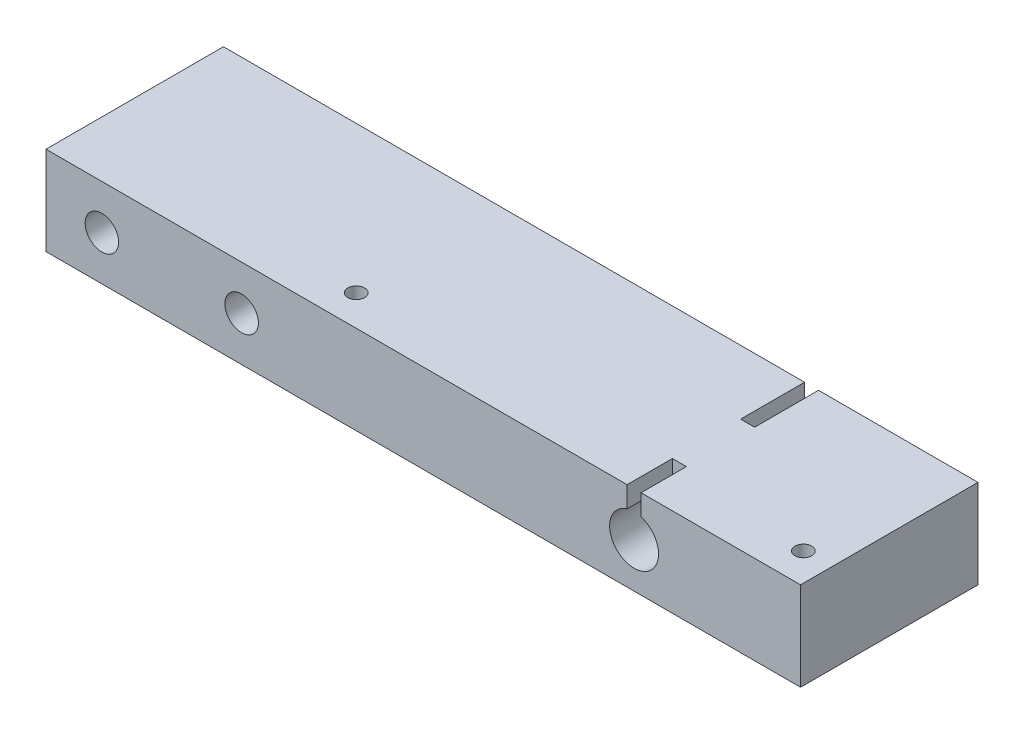
ISO-10303-21;
HEADER;
FILE_DESCRIPTION(('STEP AP214'),'2;1');
FILE_NAME('part.step','',(''),(''),'','','');
FILE_SCHEMA(('AUTOMOTIVE_DESIGN { 1 0 10303 214 1 1 1 1 }'));
ENDSEC;
DATA;
#1=APPLICATION_CONTEXT('core data for automotive mechanical design processes');
#2=APPLICATION_PROTOCOL_DEFINITION('international standard','automotive_design',2000,#1);
#3=PRODUCT_CONTEXT('',#1,'mechanical');
#4=PRODUCT('Part','Part','',(#3));
#5=PRODUCT_RELATED_PRODUCT_CATEGORY('part','',(#4));
#6=PRODUCT_DEFINITION_FORMATION('','',#4);
#7=PRODUCT_DEFINITION_CONTEXT('part definition',#1,'design');
#8=PRODUCT_DEFINITION('design','',#6,#7);
#9=PRODUCT_DEFINITION_SHAPE('','',#8);
#10=(LENGTH_UNIT() NAMED_UNIT(*) SI_UNIT(.MILLI.,.METRE.));
#11=(NAMED_UNIT(*) PLANE_ANGLE_UNIT() SI_UNIT($,.RADIAN.));
#12=(NAMED_UNIT(*) SI_UNIT($,.STERADIAN.) SOLID_ANGLE_UNIT());
#13=UNCERTAINTY_MEASURE_WITH_UNIT(LENGTH_MEASURE(1.E-05),#10,'distance_accuracy_value','');
#14=(GEOMETRIC_REPRESENTATION_CONTEXT(3) GLOBAL_UNCERTAINTY_ASSIGNED_CONTEXT((#13)) GLOBAL_UNIT_ASSIGNED_CONTEXT((#10,
#11,#12)) REPRESENTATION_CONTEXT('',''));
#15=CARTESIAN_POINT('',(0.,0.,0.));
#16=DIRECTION('',(0.,0.,1.));
#17=DIRECTION('',(1.,0.,0.));
#18=AXIS2_PLACEMENT_3D('',#15,#16,#17);
#19=CARTESIAN_POINT('',(42.0877150460028,3.175,0.));
#20=DIRECTION('',(0.,0.,1.));
#21=DIRECTION('',(1.,0.,0.));
#22=AXIS2_PLACEMENT_3D('',#19,#20,#21);
#23=CYLINDRICAL_SURFACE('',#22,1.75);
#24=CARTESIAN_POINT('',(42.0877150460028,3.175,9.45688860373222));
#25=DIRECTION('',(0.,0.,-1.));
#26=DIRECTION('',(-1.,0.,0.));
#27=AXIS2_PLACEMENT_3D('',#24,#25,#26);
#28=CIRCLE('',#27,1.75);
#29=CARTESIAN_POINT('',(41.5877150460028,4.85205098312485,9.45688860373222));
#30=VERTEX_POINT('',#29);
#31=CARTESIAN_POINT('',(42.5877150460028,4.85205098312485,9.45688860373222));
#32=VERTEX_POINT('',#31);
#33=EDGE_CURVE('E322',#30,#32,#28,.T.);
#34=ORIENTED_EDGE('',*,*,#33,.F.);
#35=DIRECTION('',(0.,0.,1.));
#36=VECTOR('',#35,1.);
#37=CARTESIAN_POINT('',(41.5877150460028,4.85205098312485,0.));
#38=LINE('',#37,#36);
#39=CARTESIAN_POINT('',(41.5877150460028,4.85205098312485,12.7));
#40=VERTEX_POINT('',#39);
#41=EDGE_CURVE('E323',#40,#30,#38,.F.);
#42=ORIENTED_EDGE('',*,*,#41,.F.);
#43=CARTESIAN_POINT('',(42.0877150460028,3.175,12.7));
#44=DIRECTION('',(0.,0.,1.));
#45=DIRECTION('',(1.,0.,0.));
#46=AXIS2_PLACEMENT_3D('',#43,#44,#45);
#47=CIRCLE('',#46,1.75);
#48=CARTESIAN_POINT('',(42.5877150460028,4.85205098312485,12.7));
#49=VERTEX_POINT('',#48);
#50=EDGE_CURVE('E318',#40,#49,#47,.T.);
#51=ORIENTED_EDGE('',*,*,#50,.T.);
#52=DIRECTION('',(0.,0.,1.));
#53=VECTOR('',#52,1.);
#54=CARTESIAN_POINT('',(42.5877150460028,4.85205098312485,0.));
#55=LINE('',#54,#53);
#56=EDGE_CURVE('E72',#32,#49,#55,.T.);
#57=ORIENTED_EDGE('',*,*,#56,.F.);
#58=EDGE_LOOP('',(#34,#42,#51,#57));
#59=FACE_BOUND('',#58,.T.);
#60=CARTESIAN_POINT('',(42.0877150460028,3.175,0.));
#61=DIRECTION('',(0.,0.,1.));
#62=DIRECTION('',(1.,0.,0.));
#63=AXIS2_PLACEMENT_3D('',#60,#61,#62);
#64=CIRCLE('',#63,1.75);
#65=CARTESIAN_POINT('',(41.5877150460028,4.85205098312485,0.));
#66=VERTEX_POINT('',#65);
#67=CARTESIAN_POINT('',(42.5877150460028,4.85205098312485,0.));
#68=VERTEX_POINT('',#67);
#69=EDGE_CURVE('E259',#66,#68,#64,.T.);
#70=ORIENTED_EDGE('',*,*,#69,.F.);
#71=DIRECTION('',(0.,0.,1.));
#72=VECTOR('',#71,1.);
#73=CARTESIAN_POINT('',(41.5877150460028,4.85205098312485,0.));
#74=LINE('',#73,#72);
#75=CARTESIAN_POINT('',(41.5877150460028,4.85205098312485,4.57737416325741));
#76=VERTEX_POINT('',#75);
#77=EDGE_CURVE('E146',#76,#66,#74,.F.);
#78=ORIENTED_EDGE('',*,*,#77,.F.);
#79=CARTESIAN_POINT('',(42.0877150460028,3.175,4.57737416325741));
#80=DIRECTION('',(0.,0.,1.));
#81=DIRECTION('',(1.,0.,0.));
#82=AXIS2_PLACEMENT_3D('',#79,#80,#81);
#83=CIRCLE('',#82,1.75);
#84=CARTESIAN_POINT('',(42.5877150460028,4.85205098312485,4.57737416325741));
#85=VERTEX_POINT('',#84);
#86=EDGE_CURVE('E328',#85,#76,#83,.T.);
#87=ORIENTED_EDGE('',*,*,#86,.F.);
#88=DIRECTION('',(0.,0.,1.));
#89=VECTOR('',#88,1.);
#90=CARTESIAN_POINT('',(42.5877150460028,4.85205098312485,0.));
#91=LINE('',#90,#89);
#92=EDGE_CURVE('E310',#68,#85,#91,.T.);
#93=ORIENTED_EDGE('',*,*,#92,.F.);
#94=EDGE_LOOP('',(#70,#78,#87,#93));
#95=FACE_BOUND('',#94,.T.);
#96=CARTESIAN_POINT('',(41.2438838747358,1.64188260253881,7.26658983962968));
#97=CARTESIAN_POINT('',(41.2335650177173,1.64755872849969,7.23395177097413));
#98=CARTESIAN_POINT('',(41.2224999040513,1.65378757728156,7.20166301545152));
#99=CARTESIAN_POINT('',(41.1991993498274,1.66728057297219,7.13774593563371));
#100=CARTESIAN_POINT('',(41.1869644628288,1.67454423097898,7.10611730750206));
#101=CARTESIAN_POINT('',(41.1616156704365,1.69005475189646,7.04340077345724));
#102=CARTESIAN_POINT('',(41.1485003700154,1.69830319211153,7.01231382891692));
#103=CARTESIAN_POINT('',(41.1215830591988,1.71577206412213,6.95071205536086));
#104=CARTESIAN_POINT('',(41.1077809480405,1.72499263876419,6.92019731120298));
#105=CARTESIAN_POINT('',(41.0647349961694,1.75470022167026,6.82776290475933));
#106=CARTESIAN_POINT('',(41.0345988282322,1.77678867093154,6.76676294826807));
#107=CARTESIAN_POINT('',(40.9726773192387,1.82564723348366,6.64758017880724));
#108=CARTESIAN_POINT('',(40.9408935065667,1.85241306073934,6.58939484849348));
#109=CARTESIAN_POINT('',(40.8925257873214,1.89653080040825,6.50551288026816));
#110=CARTESIAN_POINT('',(40.8764555772022,1.91172339009301,6.47837895293198));
#111=CARTESIAN_POINT('',(40.8440026826922,1.94365974413757,6.42521690843567));
#112=CARTESIAN_POINT('',(40.8276199497959,1.96040375086824,6.39918896498796));
#113=CARTESIAN_POINT('',(40.794684922765,1.99553032647495,6.3487218309668));
#114=CARTESIAN_POINT('',(40.7781346954653,2.0139002449356,6.32427256050699));
#115=CARTESIAN_POINT('',(40.7447855811818,2.0526392927315,6.27721073484628));
#116=CARTESIAN_POINT('',(40.7279869017106,2.07300682574612,6.25459673904181));
#117=CARTESIAN_POINT('',(40.696021010136,2.11373524221223,6.21418679800306));
#118=CARTESIAN_POINT('',(40.6808752965179,2.13385542447774,6.19613434835597));
#119=CARTESIAN_POINT('',(40.6504600649125,2.17626096009308,6.16270581242354));
#120=CARTESIAN_POINT('',(40.6351903535373,2.19855077818875,6.147335434865));
#121=CARTESIAN_POINT('',(40.6045005564306,2.24581660613839,6.12022564826844));
#122=CARTESIAN_POINT('',(40.5890817631258,2.27082861455845,6.10854563208531));
#123=CARTESIAN_POINT('',(40.5587793368609,2.3230887774856,6.09091902595638));
#124=CARTESIAN_POINT('',(40.5438934583036,2.35032541619094,6.08494471745577));
#125=CARTESIAN_POINT('',(40.520945469859,2.39519130509058,6.0814766297643));
#126=CARTESIAN_POINT('',(40.5124835177673,2.41243134571713,6.08158630864867));
#127=CARTESIAN_POINT('',(40.4962460897301,2.44692850846639,6.08496539696803));
#128=CARTESIAN_POINT('',(40.4884700662718,2.46418560564098,6.08823226094947));
#129=CARTESIAN_POINT('',(40.4737839570593,2.49819068608464,6.09799086782508));
#130=CARTESIAN_POINT('',(40.4668755389638,2.51493764339317,6.10448870576624));
#131=CARTESIAN_POINT('',(40.4540446169743,2.54736476821522,6.12044692682219));
#132=CARTESIAN_POINT('',(40.4481228589089,2.56304412346849,6.12990953562103));
#133=CARTESIAN_POINT('',(40.4361304413012,2.59608784086249,6.15355404782419));
#134=CARTESIAN_POINT('',(40.4302859036074,2.61312246291518,6.16830847500826));
#135=CARTESIAN_POINT('',(40.4198662857908,2.64484874917086,6.20052628995993));
#136=CARTESIAN_POINT('',(40.4152934050424,2.65953633566681,6.21799429063925));
#137=CARTESIAN_POINT('',(40.4054283293952,2.69247981159572,6.26288611663973));
#138=CARTESIAN_POINT('',(40.4006909692434,2.70950177771244,6.29133142475929));
#139=CARTESIAN_POINT('',(40.3927800045866,2.73919221470893,6.35059284016948));
#140=CARTESIAN_POINT('',(40.389609755295,2.75185132725501,6.38141387235716));
#141=CARTESIAN_POINT('',(40.3830924132969,2.77871036693604,6.4603940847559));
#142=CARTESIAN_POINT('',(40.3804652523578,2.79045724640224,6.50944549924021));
#143=CARTESIAN_POINT('',(40.3769674222684,2.80635378221299,6.60879425987928));
#144=CARTESIAN_POINT('',(40.3760995693341,2.81049125680642,6.65909347339995));
#145=CARTESIAN_POINT('',(40.3757621247964,2.81205918646597,6.77330243236777));
#146=CARTESIAN_POINT('',(40.3767296549285,2.80739472676518,6.83724671538222));
#147=CARTESIAN_POINT('',(40.3810429680997,2.78787523931907,6.96343670421357));
#148=CARTESIAN_POINT('',(40.3843889135712,2.77301951557001,7.02568229371775));
#149=CARTESIAN_POINT('',(40.3941322478079,2.73376656453801,7.14717063378087));
#150=CARTESIAN_POINT('',(40.4005438778755,2.70932490306721,7.20639792755254));
#151=CARTESIAN_POINT('',(40.4174516495669,2.65192176717033,7.31992332178574));
#152=CARTESIAN_POINT('',(40.4279466776359,2.61896261631151,7.37422276111372));
#153=CARTESIAN_POINT('',(40.4544786972412,2.54523792277631,7.47755580460451));
#154=CARTESIAN_POINT('',(40.470628566139,2.50432156621177,7.52645321334753));
#155=CARTESIAN_POINT('',(40.5095362416537,2.4172948131135,7.61636052526441));
#156=CARTESIAN_POINT('',(40.5322916618544,2.37118629604991,7.65737326808667));
#157=CARTESIAN_POINT('',(40.5803472203291,2.28488042493907,7.72400419375263));
#158=CARTESIAN_POINT('',(40.6044450977317,2.24511989176435,7.75106497386926));
#159=CARTESIAN_POINT('',(40.6576638499849,2.16514817034645,7.79896324390841));
#160=CARTESIAN_POINT('',(40.6867898939412,2.12493655855533,7.81979426863951));
#161=CARTESIAN_POINT('',(40.7184608942774,2.08520962199935,7.83731699666632));
#162=B_SPLINE_CURVE_WITH_KNOTS('',3,(#96,#97,#98,#99,#100,#101,#102,#103,#104,#105,#106,#107,
#108,#109,#110,#111,#112,#113,#114,#115,#116,#117,#118,#119,#120,#121,#122,#123,#124,#125,#126,
#127,#128,#129,#130,#131,#132,#133,#134,#135,#136,#137,#138,#139,#140,#141,#142,#143,#144,#145,
#146,#147,#148,#149,#150,#151,#152,#153,#154,#155,#156,#157,#158,#159,#160,#161),.UNSPECIFIED.,
.F.,.F.,(4,2,2,2,2,2,2,2,2,2,2,2,2,2,2,2,2,2,2,2,2,2,2,2,2,2,2,2,2,2,2,2,4),(0.,
0.104055810663736,0.208062621560511,0.312238310970382,0.41642932946418,0.630819886397124,
0.845015010601311,0.949987057151363,1.05497553074894,1.1592089386983,1.26335972067125,
1.35617124631744,1.44917797131898,1.54361316291152,1.63758721520964,1.69496476861182,
1.75229610041048,1.80973599714546,1.86721911834145,1.93668092011485,2.00626212168845,
2.10616303680464,2.20627692509324,2.35697297144801,2.50791005493482,2.69930273410672,
2.89070848558083,3.08301216015794,3.27526342965628,3.47159437241899,3.66785447393443,
3.82866114416003,3.9896341237508),.UNSPECIFIED.);
#163=CARTESIAN_POINT('',(41.2438838747358,1.6418826025388,7.26658983962969));
#164=VERTEX_POINT('',#163);
#165=CARTESIAN_POINT('',(40.7184608942774,2.08520962199934,7.83731699666632));
#166=VERTEX_POINT('',#165);
#167=EDGE_CURVE('E14',#164,#166,#162,.T.);
#168=ORIENTED_EDGE('',*,*,#167,.F.);
#169=CARTESIAN_POINT('',(42.0877150460028,3.175,6.35000000000002));
#170=DIRECTION('',(-0.735703599450981,0.,-0.677303634830695));
#171=DIRECTION('',(-0.677303634830695,0.,0.735703599450981));
#172=AXIS2_PLACEMENT_3D('',#169,#170,#171);
#173=ELLIPSE('',#172,2.58377470606289,1.75);
#174=EDGE_CURVE('E59',#166,#164,#173,.F.);
#175=ORIENTED_EDGE('',*,*,#174,.F.);
#176=EDGE_LOOP('',(#168,#175));
#177=FACE_BOUND('',#176,.T.);
#178=ADVANCED_FACE('F46',(#59,#95,#177),#23,.F.);
#179=CARTESIAN_POINT('',(0.,0.,12.7));
#180=DIRECTION('',(1.,0.,0.));
#181=DIRECTION('',(0.,0.,-1.));
#182=AXIS2_PLACEMENT_3D('',#179,#180,#181);
#183=PLANE('',#182);
#184=DIRECTION('',(0.,-1.,0.));
#185=VECTOR('',#184,1.);
#186=CARTESIAN_POINT('',(0.,0.,0.));
#187=LINE('',#186,#185);
#188=CARTESIAN_POINT('',(0.,6.35,0.));
#189=VERTEX_POINT('',#188);
#190=CARTESIAN_POINT('',(0.,0.,0.));
#191=VERTEX_POINT('',#190);
#192=EDGE_CURVE('E227',#189,#191,#187,.T.);
#193=ORIENTED_EDGE('',*,*,#192,.T.);
#194=DIRECTION('',(0.,0.,-1.));
#195=VECTOR('',#194,1.);
#196=CARTESIAN_POINT('',(0.,0.,12.7));
#197=LINE('',#196,#195);
#198=CARTESIAN_POINT('',(0.,0.,12.7));
#199=VERTEX_POINT('',#198);
#200=EDGE_CURVE('E221',#199,#191,#197,.T.);
#201=ORIENTED_EDGE('',*,*,#200,.F.);
#202=DIRECTION('',(0.,-1.,0.));
#203=VECTOR('',#202,1.);
#204=CARTESIAN_POINT('',(0.,0.,12.7));
#205=LINE('',#204,#203);
#206=CARTESIAN_POINT('',(0.,6.35,12.7));
#207=VERTEX_POINT('',#206);
#208=EDGE_CURVE('E243',#207,#199,#205,.T.);
#209=ORIENTED_EDGE('',*,*,#208,.F.);
#210=DIRECTION('',(0.,0.,-1.));
#211=VECTOR('',#210,1.);
#212=CARTESIAN_POINT('',(0.,6.35,12.7));
#213=LINE('',#212,#211);
#214=EDGE_CURVE('E244',#207,#189,#213,.T.);
#215=ORIENTED_EDGE('',*,*,#214,.T.);
#216=EDGE_LOOP('',(#193,#201,#209,#215));
#217=FACE_BOUND('',#216,.T.);
#218=ADVANCED_FACE('F48',(#217),#183,.F.);
#219=CARTESIAN_POINT('',(0.,0.,12.7));
#220=DIRECTION('',(0.,1.,0.));
#221=DIRECTION('',(0.,0.,1.));
#222=AXIS2_PLACEMENT_3D('',#219,#220,#221);
#223=PLANE('',#222);
#224=CARTESIAN_POINT('',(20.,0.,10.5));
#225=DIRECTION('',(0.,1.,0.));
#226=DIRECTION('',(0.,0.,1.));
#227=AXIS2_PLACEMENT_3D('',#224,#225,#226);
#228=CIRCLE('',#227,0.6);
#229=CARTESIAN_POINT('',(20.,0.,11.1));
#230=VERTEX_POINT('',#229);
#231=EDGE_CURVE('E209',#230,#230,#228,.T.);
#232=ORIENTED_EDGE('',*,*,#231,.T.);
#233=EDGE_LOOP('',(#232));
#234=FACE_BOUND('',#233,.T.);
#235=CARTESIAN_POINT('',(52.,0.,10.5));
#236=DIRECTION('',(0.,1.,0.));
#237=DIRECTION('',(0.,0.,1.));
#238=AXIS2_PLACEMENT_3D('',#235,#236,#237);
#239=CIRCLE('',#238,0.600000000000001);
#240=CARTESIAN_POINT('',(52.,0.,11.1));
#241=VERTEX_POINT('',#240);
#242=EDGE_CURVE('E213',#241,#241,#239,.T.);
#243=ORIENTED_EDGE('',*,*,#242,.T.);
#244=EDGE_LOOP('',(#243));
#245=FACE_BOUND('',#244,.T.);
#246=DIRECTION('',(1.,0.,0.));
#247=VECTOR('',#246,1.);
#248=CARTESIAN_POINT('',(0.,0.,0.));
#249=LINE('',#248,#247);
#250=CARTESIAN_POINT('',(54.,0.,0.));
#251=VERTEX_POINT('',#250);
#252=EDGE_CURVE('E216',#191,#251,#249,.T.);
#253=ORIENTED_EDGE('',*,*,#252,.T.);
#254=DIRECTION('',(0.,0.,-1.));
#255=VECTOR('',#254,1.);
#256=CARTESIAN_POINT('',(54.,0.,12.7));
#257=LINE('',#256,#255);
#258=CARTESIAN_POINT('',(54.,0.,12.7));
#259=VERTEX_POINT('',#258);
#260=EDGE_CURVE('E218',#259,#251,#257,.T.);
#261=ORIENTED_EDGE('',*,*,#260,.F.);
#262=DIRECTION('',(1.,0.,0.));
#263=VECTOR('',#262,1.);
#264=CARTESIAN_POINT('',(0.,0.,12.7));
#265=LINE('',#264,#263);
#266=EDGE_CURVE('E288',#199,#259,#265,.T.);
#267=ORIENTED_EDGE('',*,*,#266,.F.);
#268=ORIENTED_EDGE('',*,*,#200,.T.);
#269=EDGE_LOOP('',(#253,#261,#267,#268));
#270=FACE_BOUND('',#269,.T.);
#271=ADVANCED_FACE('F155',(#234,#245,#270),#223,.F.);
#272=CARTESIAN_POINT('',(54.,0.,12.7));
#273=DIRECTION('',(-1.,0.,0.));
#274=DIRECTION('',(0.,0.,1.));
#275=AXIS2_PLACEMENT_3D('',#272,#273,#274);
#276=PLANE('',#275);
#277=DIRECTION('',(0.,1.,0.));
#278=VECTOR('',#277,1.);
#279=CARTESIAN_POINT('',(54.,0.,0.));
#280=LINE('',#279,#278);
#281=CARTESIAN_POINT('',(54.,6.35,0.));
#282=VERTEX_POINT('',#281);
#283=EDGE_CURVE('E226',#251,#282,#280,.T.);
#284=ORIENTED_EDGE('',*,*,#283,.T.);
#285=DIRECTION('',(0.,0.,-1.));
#286=VECTOR('',#285,1.);
#287=CARTESIAN_POINT('',(54.,6.35,12.7));
#288=LINE('',#287,#286);
#289=CARTESIAN_POINT('',(54.,6.35,12.7));
#290=VERTEX_POINT('',#289);
#291=EDGE_CURVE('E232',#290,#282,#288,.T.);
#292=ORIENTED_EDGE('',*,*,#291,.F.);
#293=DIRECTION('',(0.,1.,0.));
#294=VECTOR('',#293,1.);
#295=CARTESIAN_POINT('',(54.,0.,12.7));
#296=LINE('',#295,#294);
#297=EDGE_CURVE('E231',#259,#290,#296,.T.);
#298=ORIENTED_EDGE('',*,*,#297,.F.);
#299=ORIENTED_EDGE('',*,*,#260,.T.);
#300=EDGE_LOOP('',(#284,#292,#298,#299));
#301=FACE_BOUND('',#300,.T.);
#302=ADVANCED_FACE('F198',(#301),#276,.F.);
#303=CARTESIAN_POINT('',(0.,6.35,12.7));
#304=DIRECTION('',(0.,-1.,0.));
#305=DIRECTION('',(0.,0.,-1.));
#306=AXIS2_PLACEMENT_3D('',#303,#304,#305);
#307=PLANE('',#306);
#308=CARTESIAN_POINT('',(20.,6.35,10.5));
#309=DIRECTION('',(0.,1.,0.));
#310=DIRECTION('',(0.,0.,1.));
#311=AXIS2_PLACEMENT_3D('',#308,#309,#310);
#312=CIRCLE('',#311,0.6);
#313=CARTESIAN_POINT('',(20.,6.35,11.1));
#314=VERTEX_POINT('',#313);
#315=EDGE_CURVE('E336',#314,#314,#312,.T.);
#316=ORIENTED_EDGE('',*,*,#315,.F.);
#317=EDGE_LOOP('',(#316));
#318=FACE_BOUND('',#317,.T.);
#319=CARTESIAN_POINT('',(52.,6.35,10.5));
#320=DIRECTION('',(0.,1.,0.));
#321=DIRECTION('',(0.,0.,1.));
#322=AXIS2_PLACEMENT_3D('',#319,#320,#321);
#323=CIRCLE('',#322,0.600000000000001);
#324=CARTESIAN_POINT('',(52.,6.35,11.1));
#325=VERTEX_POINT('',#324);
#326=EDGE_CURVE('E332',#325,#325,#323,.T.);
#327=ORIENTED_EDGE('',*,*,#326,.F.);
#328=EDGE_LOOP('',(#327));
#329=FACE_BOUND('',#328,.T.);
#330=DIRECTION('',(-1.,0.,0.));
#331=VECTOR('',#330,1.);
#332=CARTESIAN_POINT('',(0.,6.35,0.));
#333=LINE('',#332,#331);
#334=CARTESIAN_POINT('',(42.5877150460028,6.35,0.));
#335=VERTEX_POINT('',#334);
#336=EDGE_CURVE('E237',#282,#335,#333,.T.);
#337=ORIENTED_EDGE('',*,*,#336,.T.);
#338=DIRECTION('',(0.,0.,-1.));
#339=VECTOR('',#338,1.);
#340=CARTESIAN_POINT('',(42.5877150460028,6.35,0.));
#341=LINE('',#340,#339);
#342=CARTESIAN_POINT('',(42.5877150460028,6.35,4.57737416325741));
#343=VERTEX_POINT('',#342);
#344=EDGE_CURVE('E302',#343,#335,#341,.T.);
#345=ORIENTED_EDGE('',*,*,#344,.F.);
#346=DIRECTION('',(1.,0.,0.));
#347=VECTOR('',#346,1.);
#348=CARTESIAN_POINT('',(42.5877150460028,6.35,4.57737416325741));
#349=LINE('',#348,#347);
#350=CARTESIAN_POINT('',(41.5877150460028,6.35,4.57737416325741));
#351=VERTEX_POINT('',#350);
#352=EDGE_CURVE('E265',#351,#343,#349,.T.);
#353=ORIENTED_EDGE('',*,*,#352,.F.);
#354=DIRECTION('',(0.,0.,1.));
#355=VECTOR('',#354,1.);
#356=CARTESIAN_POINT('',(41.5877150460028,6.35,0.));
#357=LINE('',#356,#355);
#358=CARTESIAN_POINT('',(41.5877150460028,6.35,0.));
#359=VERTEX_POINT('',#358);
#360=EDGE_CURVE('E299',#359,#351,#357,.T.);
#361=ORIENTED_EDGE('',*,*,#360,.F.);
#362=EDGE_CURVE('E238',#359,#189,#333,.T.);
#363=ORIENTED_EDGE('',*,*,#362,.T.);
#364=ORIENTED_EDGE('',*,*,#214,.F.);
#365=DIRECTION('',(-1.,0.,0.));
#366=VECTOR('',#365,1.);
#367=CARTESIAN_POINT('',(0.,6.35,12.7));
#368=LINE('',#367,#366);
#369=CARTESIAN_POINT('',(41.5877150460028,6.35,12.7));
#370=VERTEX_POINT('',#369);
#371=EDGE_CURVE('E291',#370,#207,#368,.T.);
#372=ORIENTED_EDGE('',*,*,#371,.F.);
#373=DIRECTION('',(0.,0.,1.));
#374=VECTOR('',#373,1.);
#375=CARTESIAN_POINT('',(41.5877150460028,6.35,12.7));
#376=LINE('',#375,#374);
#377=CARTESIAN_POINT('',(41.5877150460028,6.35,9.45688860373222));
#378=VERTEX_POINT('',#377);
#379=EDGE_CURVE('E275',#378,#370,#376,.T.);
#380=ORIENTED_EDGE('',*,*,#379,.F.);
#381=DIRECTION('',(-1.,0.,0.));
#382=VECTOR('',#381,1.);
#383=CARTESIAN_POINT('',(42.5877150460028,6.35,9.45688860373222));
#384=LINE('',#383,#382);
#385=CARTESIAN_POINT('',(42.5877150460028,6.35,9.45688860373222));
#386=VERTEX_POINT('',#385);
#387=EDGE_CURVE('E272',#386,#378,#384,.T.);
#388=ORIENTED_EDGE('',*,*,#387,.F.);
#389=DIRECTION('',(0.,0.,-1.));
#390=VECTOR('',#389,1.);
#391=CARTESIAN_POINT('',(42.5877150460028,6.35,12.7));
#392=LINE('',#391,#390);
#393=CARTESIAN_POINT('',(42.5877150460028,6.35,12.7));
#394=VERTEX_POINT('',#393);
#395=EDGE_CURVE('E269',#394,#386,#392,.T.);
#396=ORIENTED_EDGE('',*,*,#395,.F.);
#397=EDGE_CURVE('E247',#290,#394,#368,.T.);
#398=ORIENTED_EDGE('',*,*,#397,.F.);
#399=ORIENTED_EDGE('',*,*,#291,.T.);
#400=EDGE_LOOP('',(#337,#345,#353,#361,#363,#364,#372,#380,#388,#396,#398,#399));
#401=FACE_BOUND('',#400,.T.);
#402=ADVANCED_FACE('F191',(#318,#329,#401),#307,.F.);
#403=CARTESIAN_POINT('',(0.,0.,12.7));
#404=DIRECTION('',(0.,0.,-1.));
#405=DIRECTION('',(-1.,0.,0.));
#406=AXIS2_PLACEMENT_3D('',#403,#404,#405);
#407=PLANE('',#406);
#408=CARTESIAN_POINT('',(14.,3.175,12.7));
#409=DIRECTION('',(0.,0.,1.));
#410=DIRECTION('',(1.,0.,0.));
#411=AXIS2_PLACEMENT_3D('',#408,#409,#410);
#412=CIRCLE('',#411,1.2);
#413=CARTESIAN_POINT('',(15.2,3.175,12.7));
#414=VERTEX_POINT('',#413);
#415=EDGE_CURVE('E347',#414,#414,#412,.T.);
#416=ORIENTED_EDGE('',*,*,#415,.F.);
#417=EDGE_LOOP('',(#416));
#418=FACE_BOUND('',#417,.T.);
#419=CARTESIAN_POINT('',(4.,3.175,12.7));
#420=DIRECTION('',(0.,0.,1.));
#421=DIRECTION('',(1.,0.,0.));
#422=AXIS2_PLACEMENT_3D('',#419,#420,#421);
#423=CIRCLE('',#422,1.2);
#424=CARTESIAN_POINT('',(5.2,3.175,12.7));
#425=VERTEX_POINT('',#424);
#426=EDGE_CURVE('E341',#425,#425,#423,.T.);
#427=ORIENTED_EDGE('',*,*,#426,.F.);
#428=EDGE_LOOP('',(#427));
#429=FACE_BOUND('',#428,.T.);
#430=DIRECTION('',(0.,1.,0.));
#431=VECTOR('',#430,1.);
#432=CARTESIAN_POINT('',(42.5877150460028,4.35,12.7));
#433=LINE('',#432,#431);
#434=EDGE_CURVE('E279',#49,#394,#433,.T.);
#435=ORIENTED_EDGE('',*,*,#434,.F.);
#436=ORIENTED_EDGE('',*,*,#50,.F.);
#437=DIRECTION('',(0.,1.,0.));
#438=VECTOR('',#437,1.);
#439=CARTESIAN_POINT('',(41.5877150460028,4.35,12.7));
#440=LINE('',#439,#438);
#441=EDGE_CURVE('E281',#40,#370,#440,.T.);
#442=ORIENTED_EDGE('',*,*,#441,.T.);
#443=ORIENTED_EDGE('',*,*,#371,.T.);
#444=ORIENTED_EDGE('',*,*,#208,.T.);
#445=ORIENTED_EDGE('',*,*,#266,.T.);
#446=ORIENTED_EDGE('',*,*,#297,.T.);
#447=ORIENTED_EDGE('',*,*,#397,.T.);
#448=EDGE_LOOP('',(#435,#436,#442,#443,#444,#445,#446,#447));
#449=FACE_BOUND('',#448,.T.);
#450=ADVANCED_FACE('F188',(#418,#429,#449),#407,.F.);
#451=CARTESIAN_POINT('',(0.,0.,0.));
#452=DIRECTION('',(0.,0.,-1.));
#453=DIRECTION('',(-1.,0.,0.));
#454=AXIS2_PLACEMENT_3D('',#451,#452,#453);
#455=PLANE('',#454);
#456=CARTESIAN_POINT('',(33.0714650250297,2.21128690467614,0.));
#457=DIRECTION('',(0.,0.,-1.));
#458=DIRECTION('',(1.,0.,0.));
#459=AXIS2_PLACEMENT_3D('',#456,#457,#458);
#460=ELLIPSE('',#459,0.885865613507276,0.600000000000001);
#461=CARTESIAN_POINT('',(33.957330638537,2.21128690467614,0.));
#462=VERTEX_POINT('',#461);
#463=EDGE_CURVE('E149',#462,#462,#460,.F.);
#464=ORIENTED_EDGE('',*,*,#463,.T.);
#465=EDGE_LOOP('',(#464));
#466=FACE_BOUND('',#465,.T.);
#467=CARTESIAN_POINT('',(14.,3.175,0.));
#468=DIRECTION('',(0.,0.,1.));
#469=DIRECTION('',(1.,0.,0.));
#470=AXIS2_PLACEMENT_3D('',#467,#468,#469);
#471=CIRCLE('',#470,1.2);
#472=CARTESIAN_POINT('',(15.2,3.175,0.));
#473=VERTEX_POINT('',#472);
#474=EDGE_CURVE('E344',#473,#473,#471,.T.);
#475=ORIENTED_EDGE('',*,*,#474,.T.);
#476=EDGE_LOOP('',(#475));
#477=FACE_BOUND('',#476,.T.);
#478=CARTESIAN_POINT('',(4.,3.175,0.));
#479=DIRECTION('',(0.,0.,1.));
#480=DIRECTION('',(1.,0.,0.));
#481=AXIS2_PLACEMENT_3D('',#478,#479,#480);
#482=CIRCLE('',#481,1.2);
#483=CARTESIAN_POINT('',(5.2,3.175,0.));
#484=VERTEX_POINT('',#483);
#485=EDGE_CURVE('E339',#484,#484,#482,.T.);
#486=ORIENTED_EDGE('',*,*,#485,.T.);
#487=EDGE_LOOP('',(#486));
#488=FACE_BOUND('',#487,.T.);
#489=ORIENTED_EDGE('',*,*,#69,.T.);
#490=DIRECTION('',(0.,1.,0.));
#491=VECTOR('',#490,1.);
#492=CARTESIAN_POINT('',(42.5877150460028,4.35,0.));
#493=LINE('',#492,#491);
#494=EDGE_CURVE('E261',#68,#335,#493,.T.);
#495=ORIENTED_EDGE('',*,*,#494,.T.);
#496=ORIENTED_EDGE('',*,*,#336,.F.);
#497=ORIENTED_EDGE('',*,*,#283,.F.);
#498=ORIENTED_EDGE('',*,*,#252,.F.);
#499=ORIENTED_EDGE('',*,*,#192,.F.);
#500=ORIENTED_EDGE('',*,*,#362,.F.);
#501=DIRECTION('',(0.,1.,0.));
#502=VECTOR('',#501,1.);
#503=CARTESIAN_POINT('',(41.5877150460028,4.35,0.));
#504=LINE('',#503,#502);
#505=EDGE_CURVE('E254',#66,#359,#504,.T.);
#506=ORIENTED_EDGE('',*,*,#505,.F.);
#507=EDGE_LOOP('',(#489,#495,#496,#497,#498,#499,#500,#506));
#508=FACE_BOUND('',#507,.T.);
#509=ADVANCED_FACE('F186',(#466,#477,#488,#508),#455,.T.);
#510=CARTESIAN_POINT('',(42.5877150460028,4.35,12.7));
#511=DIRECTION('',(1.,0.,0.));
#512=DIRECTION('',(0.,0.,-1.));
#513=AXIS2_PLACEMENT_3D('',#510,#511,#512);
#514=PLANE('',#513);
#515=DIRECTION('',(0.,1.,0.));
#516=VECTOR('',#515,1.);
#517=CARTESIAN_POINT('',(42.5877150460028,4.35,9.45688860373222));
#518=LINE('',#517,#516);
#519=EDGE_CURVE('E278',#32,#386,#518,.T.);
#520=ORIENTED_EDGE('',*,*,#519,.F.);
#521=ORIENTED_EDGE('',*,*,#56,.T.);
#522=ORIENTED_EDGE('',*,*,#434,.T.);
#523=ORIENTED_EDGE('',*,*,#395,.T.);
#524=EDGE_LOOP('',(#520,#521,#522,#523));
#525=FACE_BOUND('',#524,.T.);
#526=ADVANCED_FACE('F179',(#525),#514,.F.);
#527=CARTESIAN_POINT('',(41.5877150460028,4.35,12.7));
#528=DIRECTION('',(-1.,0.,0.));
#529=DIRECTION('',(0.,0.,1.));
#530=AXIS2_PLACEMENT_3D('',#527,#528,#529);
#531=PLANE('',#530);
#532=ORIENTED_EDGE('',*,*,#441,.F.);
#533=ORIENTED_EDGE('',*,*,#41,.T.);
#534=DIRECTION('',(0.,1.,0.));
#535=VECTOR('',#534,1.);
#536=CARTESIAN_POINT('',(41.5877150460028,4.35,9.45688860373222));
#537=LINE('',#536,#535);
#538=EDGE_CURVE('E283',#30,#378,#537,.T.);
#539=ORIENTED_EDGE('',*,*,#538,.T.);
#540=ORIENTED_EDGE('',*,*,#379,.T.);
#541=EDGE_LOOP('',(#532,#533,#539,#540));
#542=FACE_BOUND('',#541,.T.);
#543=ADVANCED_FACE('F176',(#542),#531,.F.);
#544=CARTESIAN_POINT('',(42.5877150460028,4.35,9.45688860373222));
#545=DIRECTION('',(0.,0.,-1.));
#546=DIRECTION('',(-1.,0.,0.));
#547=AXIS2_PLACEMENT_3D('',#544,#545,#546);
#548=PLANE('',#547);
#549=ORIENTED_EDGE('',*,*,#538,.F.);
#550=ORIENTED_EDGE('',*,*,#33,.T.);
#551=ORIENTED_EDGE('',*,*,#519,.T.);
#552=ORIENTED_EDGE('',*,*,#387,.T.);
#553=EDGE_LOOP('',(#549,#550,#551,#552));
#554=FACE_BOUND('',#553,.T.);
#555=ADVANCED_FACE('F174',(#554),#548,.F.);
#556=CARTESIAN_POINT('',(42.5877150460028,4.35,0.));
#557=DIRECTION('',(1.,0.,0.));
#558=DIRECTION('',(0.,0.,-1.));
#559=AXIS2_PLACEMENT_3D('',#556,#557,#558);
#560=PLANE('',#559);
#561=ORIENTED_EDGE('',*,*,#494,.F.);
#562=ORIENTED_EDGE('',*,*,#92,.T.);
#563=DIRECTION('',(0.,1.,0.));
#564=VECTOR('',#563,1.);
#565=CARTESIAN_POINT('',(42.5877150460028,4.35,4.57737416325741));
#566=LINE('',#565,#564);
#567=EDGE_CURVE('E263',#85,#343,#566,.T.);
#568=ORIENTED_EDGE('',*,*,#567,.T.);
#569=ORIENTED_EDGE('',*,*,#344,.T.);
#570=EDGE_LOOP('',(#561,#562,#568,#569));
#571=FACE_BOUND('',#570,.T.);
#572=ADVANCED_FACE('F167',(#571),#560,.F.);
#573=CARTESIAN_POINT('',(42.5877150460028,4.35,4.57737416325741));
#574=DIRECTION('',(0.,0.,1.));
#575=DIRECTION('',(1.,0.,0.));
#576=AXIS2_PLACEMENT_3D('',#573,#574,#575);
#577=PLANE('',#576);
#578=ORIENTED_EDGE('',*,*,#567,.F.);
#579=ORIENTED_EDGE('',*,*,#86,.T.);
#580=DIRECTION('',(0.,1.,0.));
#581=VECTOR('',#580,1.);
#582=CARTESIAN_POINT('',(41.5877150460028,4.35,4.57737416325741));
#583=LINE('',#582,#581);
#584=EDGE_CURVE('E256',#76,#351,#583,.T.);
#585=ORIENTED_EDGE('',*,*,#584,.T.);
#586=ORIENTED_EDGE('',*,*,#352,.T.);
#587=EDGE_LOOP('',(#578,#579,#585,#586));
#588=FACE_BOUND('',#587,.T.);
#589=ADVANCED_FACE('F163',(#588),#577,.F.);
#590=CARTESIAN_POINT('',(41.5877150460028,4.35,0.));
#591=DIRECTION('',(-1.,0.,0.));
#592=DIRECTION('',(0.,0.,1.));
#593=AXIS2_PLACEMENT_3D('',#590,#591,#592);
#594=PLANE('',#593);
#595=ORIENTED_EDGE('',*,*,#584,.F.);
#596=ORIENTED_EDGE('',*,*,#77,.T.);
#597=ORIENTED_EDGE('',*,*,#505,.T.);
#598=ORIENTED_EDGE('',*,*,#360,.T.);
#599=EDGE_LOOP('',(#595,#596,#597,#598));
#600=FACE_BOUND('',#599,.T.);
#601=ADVANCED_FACE('F166',(#600),#594,.F.);
#602=CARTESIAN_POINT('',(52.,0.,10.5));
#603=DIRECTION('',(0.,1.,0.));
#604=DIRECTION('',(0.,0.,1.));
#605=AXIS2_PLACEMENT_3D('',#602,#603,#604);
#606=CYLINDRICAL_SURFACE('',#605,0.600000000000001);
#607=ORIENTED_EDGE('',*,*,#242,.F.);
#608=EDGE_LOOP('',(#607));
#609=FACE_BOUND('',#608,.T.);
#610=ORIENTED_EDGE('',*,*,#326,.T.);
#611=EDGE_LOOP('',(#610));
#612=FACE_BOUND('',#611,.T.);
#613=ADVANCED_FACE('F161',(#609,#612),#606,.F.);
#614=CARTESIAN_POINT('',(20.,0.,10.5));
#615=DIRECTION('',(0.,1.,0.));
#616=DIRECTION('',(0.,0.,1.));
#617=AXIS2_PLACEMENT_3D('',#614,#615,#616);
#618=CYLINDRICAL_SURFACE('',#617,0.6);
#619=ORIENTED_EDGE('',*,*,#231,.F.);
#620=EDGE_LOOP('',(#619));
#621=FACE_BOUND('',#620,.T.);
#622=ORIENTED_EDGE('',*,*,#315,.T.);
#623=EDGE_LOOP('',(#622));
#624=FACE_BOUND('',#623,.T.);
#625=ADVANCED_FACE('F369',(#621,#624),#618,.F.);
#626=CARTESIAN_POINT('',(4.,3.175,0.));
#627=DIRECTION('',(0.,0.,1.));
#628=DIRECTION('',(1.,0.,0.));
#629=AXIS2_PLACEMENT_3D('',#626,#627,#628);
#630=CYLINDRICAL_SURFACE('',#629,1.2);
#631=ORIENTED_EDGE('',*,*,#485,.F.);
#632=EDGE_LOOP('',(#631));
#633=FACE_BOUND('',#632,.T.);
#634=ORIENTED_EDGE('',*,*,#426,.T.);
#635=EDGE_LOOP('',(#634));
#636=FACE_BOUND('',#635,.T.);
#637=ADVANCED_FACE('F363',(#633,#636),#630,.F.);
#638=CARTESIAN_POINT('',(14.,3.175,0.));
#639=DIRECTION('',(0.,0.,1.));
#640=DIRECTION('',(1.,0.,0.));
#641=AXIS2_PLACEMENT_3D('',#638,#639,#640);
#642=CYLINDRICAL_SURFACE('',#641,1.2);
#643=ORIENTED_EDGE('',*,*,#474,.F.);
#644=EDGE_LOOP('',(#643));
#645=FACE_BOUND('',#644,.T.);
#646=ORIENTED_EDGE('',*,*,#415,.T.);
#647=EDGE_LOOP('',(#646));
#648=FACE_BOUND('',#647,.T.);
#649=ADVANCED_FACE('F357',(#645,#648),#642,.F.);
#650=CARTESIAN_POINT('',(30.0802160774697,2.21128690467614,-2.75380436683705));
#651=DIRECTION('',(0.73570359945098,0.,0.677303634830695));
#652=DIRECTION('',(0.677303634830695,0.,-0.735703599450981));
#653=AXIS2_PLACEMENT_3D('',#650,#651,#652);
#654=CYLINDRICAL_SURFACE('',#653,0.600000000000001);
#655=ORIENTED_EDGE('',*,*,#463,.F.);
#656=EDGE_LOOP('',(#655));
#657=FACE_BOUND('',#656,.T.);
#658=ORIENTED_EDGE('',*,*,#167,.T.);
#659=CARTESIAN_POINT('',(41.1157700692345,2.21128690467614,7.40575015562337));
#660=DIRECTION('',(-0.735703599450981,0.,-0.677303634830695));
#661=DIRECTION('',(-0.677303634830695,0.,0.735703599450981));
#662=AXIS2_PLACEMENT_3D('',#659,#660,#661);
#663=CIRCLE('',#662,0.600000000000001);
#664=EDGE_CURVE('E65',#164,#166,#663,.T.);
#665=ORIENTED_EDGE('',*,*,#664,.F.);
#666=EDGE_LOOP('',(#658,#665));
#667=FACE_BOUND('',#666,.T.);
#668=ADVANCED_FACE('F148',(#657,#667),#654,.F.);
#669=CARTESIAN_POINT('',(41.1157700692345,2.21128690467614,7.40575015562337));
#670=DIRECTION('',(-0.735703599450981,0.,-0.677303634830695));
#671=DIRECTION('',(-0.677303634830695,0.,0.735703599450981));
#672=AXIS2_PLACEMENT_3D('',#669,#670,#671);
#673=PLANE('',#672);
#674=ORIENTED_EDGE('',*,*,#174,.T.);
#675=ORIENTED_EDGE('',*,*,#664,.T.);
#676=EDGE_LOOP('',(#674,#675));
#677=FACE_BOUND('',#676,.T.);
#678=ADVANCED_FACE('F143',(#677),#673,.T.);
#679=CLOSED_SHELL('',(#178,#218,#271,#302,#402,#450,#509,#526,#543,#555,#572,#589,#601,#613,
#625,#637,#649,#668,#678));
#680=MANIFOLD_SOLID_BREP('B2',#679);
#681=ADVANCED_BREP_SHAPE_REPRESENTATION('',(#18,#680),#14);
#682=SHAPE_DEFINITION_REPRESENTATION(#9,#681);
ENDSEC;
END-ISO-10303-21;
